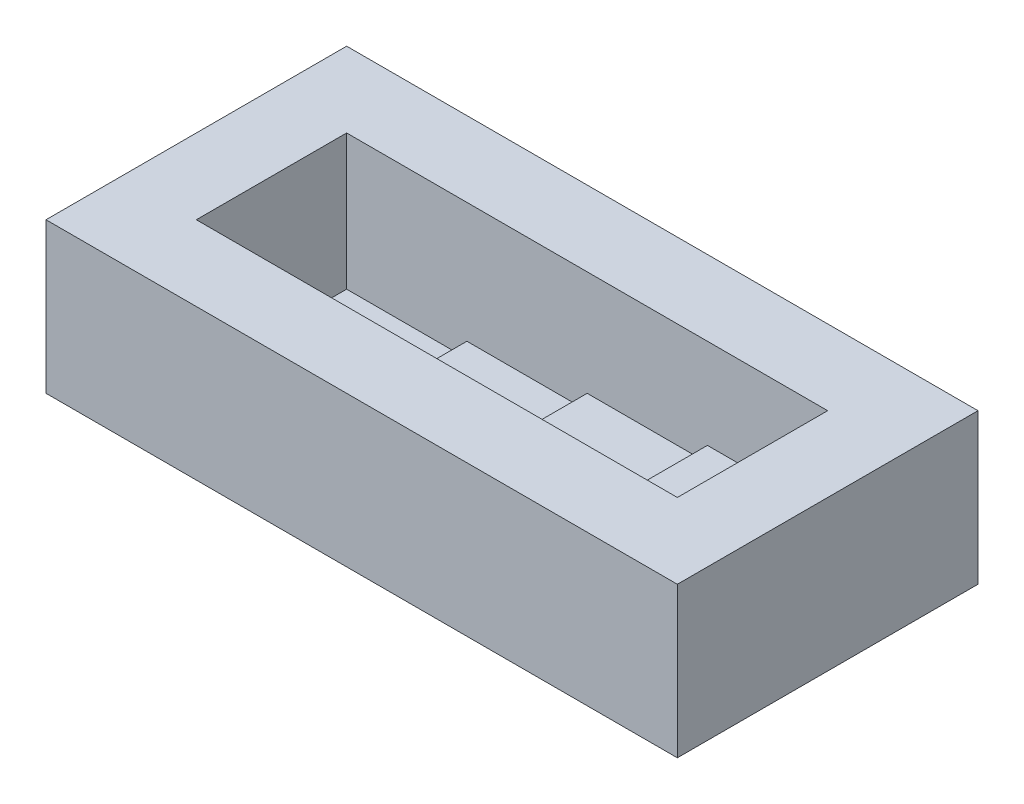
ISO-10303-21;
HEADER;
FILE_DESCRIPTION(('STEP AP214'),'2;1');
FILE_NAME('part.step','',(''),(''),'','','');
FILE_SCHEMA(('AUTOMOTIVE_DESIGN { 1 0 10303 214 1 1 1 1 }'));
ENDSEC;
DATA;
#1=APPLICATION_CONTEXT('core data for automotive mechanical design processes');
#2=APPLICATION_PROTOCOL_DEFINITION('international standard','automotive_design',2000,#1);
#3=PRODUCT_CONTEXT('',#1,'mechanical');
#4=PRODUCT('Part','Part','',(#3));
#5=PRODUCT_RELATED_PRODUCT_CATEGORY('part','',(#4));
#6=PRODUCT_DEFINITION_FORMATION('','',#4);
#7=PRODUCT_DEFINITION_CONTEXT('part definition',#1,'design');
#8=PRODUCT_DEFINITION('design','',#6,#7);
#9=PRODUCT_DEFINITION_SHAPE('','',#8);
#10=(LENGTH_UNIT() NAMED_UNIT(*) SI_UNIT(.MILLI.,.METRE.));
#11=(NAMED_UNIT(*) PLANE_ANGLE_UNIT() SI_UNIT($,.RADIAN.));
#12=(NAMED_UNIT(*) SI_UNIT($,.STERADIAN.) SOLID_ANGLE_UNIT());
#13=UNCERTAINTY_MEASURE_WITH_UNIT(LENGTH_MEASURE(1.E-05),#10,'distance_accuracy_value','');
#14=(GEOMETRIC_REPRESENTATION_CONTEXT(3) GLOBAL_UNCERTAINTY_ASSIGNED_CONTEXT((#13)) GLOBAL_UNIT_ASSIGNED_CONTEXT((#10,
#11,#12)) REPRESENTATION_CONTEXT('',''));
#15=CARTESIAN_POINT('',(0.,0.,0.));
#16=DIRECTION('',(0.,0.,1.));
#17=DIRECTION('',(1.,0.,0.));
#18=AXIS2_PLACEMENT_3D('',#15,#16,#17);
#19=CARTESIAN_POINT('',(20.,0.,10.));
#20=DIRECTION('',(0.,1.,0.));
#21=DIRECTION('',(-1.,0.,0.));
#22=AXIS2_PLACEMENT_3D('',#19,#20,#21);
#23=PLANE('',#22);
#24=DIRECTION('',(0.,0.,-1.));
#25=VECTOR('',#24,1.);
#26=CARTESIAN_POINT('',(-5.,0.,0.));
#27=LINE('',#26,#25);
#28=CARTESIAN_POINT('',(-5.,0.,15.));
#29=VERTEX_POINT('',#28);
#30=CARTESIAN_POINT('',(-5.,0.,-5.));
#31=VERTEX_POINT('',#30);
#32=EDGE_CURVE('E132',#29,#31,#27,.T.);
#33=ORIENTED_EDGE('',*,*,#32,.T.);
#34=DIRECTION('',(-1.,0.,0.));
#35=VECTOR('',#34,1.);
#36=CARTESIAN_POINT('',(-5.,0.,-5.));
#37=LINE('',#36,#35);
#38=CARTESIAN_POINT('',(37.,0.,-5.));
#39=VERTEX_POINT('',#38);
#40=EDGE_CURVE('E180',#39,#31,#37,.T.);
#41=ORIENTED_EDGE('',*,*,#40,.F.);
#42=DIRECTION('',(0.,0.,-1.));
#43=VECTOR('',#42,1.);
#44=CARTESIAN_POINT('',(37.,0.,10.));
#45=LINE('',#44,#43);
#46=CARTESIAN_POINT('',(37.,0.,15.));
#47=VERTEX_POINT('',#46);
#48=EDGE_CURVE('E147',#47,#39,#45,.T.);
#49=ORIENTED_EDGE('',*,*,#48,.F.);
#50=DIRECTION('',(1.,0.,0.));
#51=VECTOR('',#50,1.);
#52=CARTESIAN_POINT('',(-5.,0.,15.));
#53=LINE('',#52,#51);
#54=EDGE_CURVE('E145',#29,#47,#53,.T.);
#55=ORIENTED_EDGE('',*,*,#54,.F.);
#56=EDGE_LOOP('',(#33,#41,#49,#55));
#57=FACE_BOUND('',#56,.T.);
#58=ADVANCED_FACE('F36',(#57),#23,.F.);
#59=CARTESIAN_POINT('',(24.,4.,10.));
#60=DIRECTION('',(0.,-1.,0.));
#61=DIRECTION('',(0.,0.,-1.));
#62=AXIS2_PLACEMENT_3D('',#59,#60,#61);
#63=PLANE('',#62);
#64=DIRECTION('',(-1.,0.,0.));
#65=VECTOR('',#64,1.);
#66=CARTESIAN_POINT('',(24.,4.,0.));
#67=LINE('',#66,#65);
#68=CARTESIAN_POINT('',(32.,4.,0.));
#69=VERTEX_POINT('',#68);
#70=CARTESIAN_POINT('',(24.,4.,0.));
#71=VERTEX_POINT('',#70);
#72=EDGE_CURVE('E141',#69,#71,#67,.T.);
#73=ORIENTED_EDGE('',*,*,#72,.T.);
#74=DIRECTION('',(0.,0.,-1.));
#75=VECTOR('',#74,1.);
#76=CARTESIAN_POINT('',(24.,4.,10.));
#77=LINE('',#76,#75);
#78=CARTESIAN_POINT('',(24.,4.,10.));
#79=VERTEX_POINT('',#78);
#80=EDGE_CURVE('E44',#79,#71,#77,.T.);
#81=ORIENTED_EDGE('',*,*,#80,.F.);
#82=DIRECTION('',(-1.,0.,0.));
#83=VECTOR('',#82,1.);
#84=CARTESIAN_POINT('',(24.,4.,10.));
#85=LINE('',#84,#83);
#86=CARTESIAN_POINT('',(32.,4.,10.));
#87=VERTEX_POINT('',#86);
#88=EDGE_CURVE('E193',#87,#79,#85,.T.);
#89=ORIENTED_EDGE('',*,*,#88,.F.);
#90=DIRECTION('',(0.,0.,-1.));
#91=VECTOR('',#90,1.);
#92=CARTESIAN_POINT('',(32.,4.,10.));
#93=LINE('',#92,#91);
#94=EDGE_CURVE('E11',#87,#69,#93,.T.);
#95=ORIENTED_EDGE('',*,*,#94,.T.);
#96=EDGE_LOOP('',(#73,#81,#89,#95));
#97=FACE_BOUND('',#96,.T.);
#98=ADVANCED_FACE('F255',(#97),#63,.F.);
#99=CARTESIAN_POINT('',(24.,3.,10.));
#100=DIRECTION('',(1.,0.,0.));
#101=DIRECTION('',(0.,0.,-1.));
#102=AXIS2_PLACEMENT_3D('',#99,#100,#101);
#103=PLANE('',#102);
#104=DIRECTION('',(0.,-1.,0.));
#105=VECTOR('',#104,1.);
#106=CARTESIAN_POINT('',(24.,3.,0.));
#107=LINE('',#106,#105);
#108=CARTESIAN_POINT('',(24.,3.,0.));
#109=VERTEX_POINT('',#108);
#110=EDGE_CURVE('E217',#71,#109,#107,.T.);
#111=ORIENTED_EDGE('',*,*,#110,.T.);
#112=DIRECTION('',(0.,0.,-1.));
#113=VECTOR('',#112,1.);
#114=CARTESIAN_POINT('',(24.,3.,10.));
#115=LINE('',#114,#113);
#116=CARTESIAN_POINT('',(24.,3.,10.));
#117=VERTEX_POINT('',#116);
#118=EDGE_CURVE('E246',#117,#109,#115,.T.);
#119=ORIENTED_EDGE('',*,*,#118,.F.);
#120=DIRECTION('',(0.,-1.,0.));
#121=VECTOR('',#120,1.);
#122=CARTESIAN_POINT('',(24.,3.,10.));
#123=LINE('',#122,#121);
#124=EDGE_CURVE('E196',#79,#117,#123,.T.);
#125=ORIENTED_EDGE('',*,*,#124,.F.);
#126=ORIENTED_EDGE('',*,*,#80,.T.);
#127=EDGE_LOOP('',(#111,#119,#125,#126));
#128=FACE_BOUND('',#127,.T.);
#129=ADVANCED_FACE('F251',(#128),#103,.F.);
#130=CARTESIAN_POINT('',(16.,3.,10.));
#131=DIRECTION('',(0.,-1.,0.));
#132=DIRECTION('',(0.,0.,-1.));
#133=AXIS2_PLACEMENT_3D('',#130,#131,#132);
#134=PLANE('',#133);
#135=DIRECTION('',(-1.,0.,0.));
#136=VECTOR('',#135,1.);
#137=CARTESIAN_POINT('',(16.,3.,0.));
#138=LINE('',#137,#136);
#139=CARTESIAN_POINT('',(16.,3.,0.));
#140=VERTEX_POINT('',#139);
#141=EDGE_CURVE('E220',#109,#140,#138,.T.);
#142=ORIENTED_EDGE('',*,*,#141,.T.);
#143=DIRECTION('',(0.,0.,-1.));
#144=VECTOR('',#143,1.);
#145=CARTESIAN_POINT('',(16.,3.,10.));
#146=LINE('',#145,#144);
#147=CARTESIAN_POINT('',(16.,3.,10.));
#148=VERTEX_POINT('',#147);
#149=EDGE_CURVE('E243',#148,#140,#146,.T.);
#150=ORIENTED_EDGE('',*,*,#149,.F.);
#151=DIRECTION('',(-1.,0.,0.));
#152=VECTOR('',#151,1.);
#153=CARTESIAN_POINT('',(16.,3.,10.));
#154=LINE('',#153,#152);
#155=EDGE_CURVE('E200',#117,#148,#154,.T.);
#156=ORIENTED_EDGE('',*,*,#155,.F.);
#157=ORIENTED_EDGE('',*,*,#118,.T.);
#158=EDGE_LOOP('',(#142,#150,#156,#157));
#159=FACE_BOUND('',#158,.T.);
#160=ADVANCED_FACE('F261',(#159),#134,.F.);
#161=CARTESIAN_POINT('',(16.,2.,10.));
#162=DIRECTION('',(1.,0.,0.));
#163=DIRECTION('',(0.,0.,-1.));
#164=AXIS2_PLACEMENT_3D('',#161,#162,#163);
#165=PLANE('',#164);
#166=DIRECTION('',(0.,-1.,0.));
#167=VECTOR('',#166,1.);
#168=CARTESIAN_POINT('',(16.,2.,0.));
#169=LINE('',#168,#167);
#170=CARTESIAN_POINT('',(16.,2.,0.));
#171=VERTEX_POINT('',#170);
#172=EDGE_CURVE('E223',#140,#171,#169,.T.);
#173=ORIENTED_EDGE('',*,*,#172,.T.);
#174=DIRECTION('',(0.,0.,-1.));
#175=VECTOR('',#174,1.);
#176=CARTESIAN_POINT('',(16.,2.,10.));
#177=LINE('',#176,#175);
#178=CARTESIAN_POINT('',(16.,2.,10.));
#179=VERTEX_POINT('',#178);
#180=EDGE_CURVE('E240',#179,#171,#177,.T.);
#181=ORIENTED_EDGE('',*,*,#180,.F.);
#182=DIRECTION('',(0.,-1.,0.));
#183=VECTOR('',#182,1.);
#184=CARTESIAN_POINT('',(16.,2.,10.));
#185=LINE('',#184,#183);
#186=EDGE_CURVE('E203',#148,#179,#185,.T.);
#187=ORIENTED_EDGE('',*,*,#186,.F.);
#188=ORIENTED_EDGE('',*,*,#149,.T.);
#189=EDGE_LOOP('',(#173,#181,#187,#188));
#190=FACE_BOUND('',#189,.T.);
#191=ADVANCED_FACE('F265',(#190),#165,.F.);
#192=CARTESIAN_POINT('',(8.,2.,10.));
#193=DIRECTION('',(0.,-1.,0.));
#194=DIRECTION('',(0.,0.,-1.));
#195=AXIS2_PLACEMENT_3D('',#192,#193,#194);
#196=PLANE('',#195);
#197=DIRECTION('',(-1.,0.,0.));
#198=VECTOR('',#197,1.);
#199=CARTESIAN_POINT('',(8.,2.,0.));
#200=LINE('',#199,#198);
#201=CARTESIAN_POINT('',(8.,2.,0.));
#202=VERTEX_POINT('',#201);
#203=EDGE_CURVE('E226',#171,#202,#200,.T.);
#204=ORIENTED_EDGE('',*,*,#203,.T.);
#205=DIRECTION('',(0.,0.,-1.));
#206=VECTOR('',#205,1.);
#207=CARTESIAN_POINT('',(8.,2.,10.));
#208=LINE('',#207,#206);
#209=CARTESIAN_POINT('',(8.,2.,10.));
#210=VERTEX_POINT('',#209);
#211=EDGE_CURVE('E237',#210,#202,#208,.T.);
#212=ORIENTED_EDGE('',*,*,#211,.F.);
#213=DIRECTION('',(-1.,0.,0.));
#214=VECTOR('',#213,1.);
#215=CARTESIAN_POINT('',(8.,2.,10.));
#216=LINE('',#215,#214);
#217=EDGE_CURVE('E206',#179,#210,#216,.T.);
#218=ORIENTED_EDGE('',*,*,#217,.F.);
#219=ORIENTED_EDGE('',*,*,#180,.T.);
#220=EDGE_LOOP('',(#204,#212,#218,#219));
#221=FACE_BOUND('',#220,.T.);
#222=ADVANCED_FACE('F286',(#221),#196,.F.);
#223=CARTESIAN_POINT('',(8.,1.,10.));
#224=DIRECTION('',(1.,0.,0.));
#225=DIRECTION('',(0.,0.,-1.));
#226=AXIS2_PLACEMENT_3D('',#223,#224,#225);
#227=PLANE('',#226);
#228=DIRECTION('',(0.,-1.,0.));
#229=VECTOR('',#228,1.);
#230=CARTESIAN_POINT('',(8.,1.,0.));
#231=LINE('',#230,#229);
#232=CARTESIAN_POINT('',(8.,1.,0.));
#233=VERTEX_POINT('',#232);
#234=EDGE_CURVE('E229',#202,#233,#231,.T.);
#235=ORIENTED_EDGE('',*,*,#234,.T.);
#236=DIRECTION('',(0.,0.,-1.));
#237=VECTOR('',#236,1.);
#238=CARTESIAN_POINT('',(8.,1.,10.));
#239=LINE('',#238,#237);
#240=CARTESIAN_POINT('',(8.,1.,10.));
#241=VERTEX_POINT('',#240);
#242=EDGE_CURVE('E234',#241,#233,#239,.T.);
#243=ORIENTED_EDGE('',*,*,#242,.F.);
#244=DIRECTION('',(0.,-1.,0.));
#245=VECTOR('',#244,1.);
#246=CARTESIAN_POINT('',(8.,1.,10.));
#247=LINE('',#246,#245);
#248=EDGE_CURVE('E209',#210,#241,#247,.T.);
#249=ORIENTED_EDGE('',*,*,#248,.F.);
#250=ORIENTED_EDGE('',*,*,#211,.T.);
#251=EDGE_LOOP('',(#235,#243,#249,#250));
#252=FACE_BOUND('',#251,.T.);
#253=ADVANCED_FACE('F284',(#252),#227,.F.);
#254=CARTESIAN_POINT('',(0.,1.,10.));
#255=DIRECTION('',(0.,-1.,0.));
#256=DIRECTION('',(0.,0.,-1.));
#257=AXIS2_PLACEMENT_3D('',#254,#255,#256);
#258=PLANE('',#257);
#259=DIRECTION('',(-1.,0.,0.));
#260=VECTOR('',#259,1.);
#261=CARTESIAN_POINT('',(0.,1.,0.));
#262=LINE('',#261,#260);
#263=CARTESIAN_POINT('',(0.,1.,0.));
#264=VERTEX_POINT('',#263);
#265=EDGE_CURVE('E197',#233,#264,#262,.T.);
#266=ORIENTED_EDGE('',*,*,#265,.T.);
#267=DIRECTION('',(0.,0.,-1.));
#268=VECTOR('',#267,1.);
#269=CARTESIAN_POINT('',(0.,1.,10.));
#270=LINE('',#269,#268);
#271=CARTESIAN_POINT('',(0.,1.,10.));
#272=VERTEX_POINT('',#271);
#273=EDGE_CURVE('E51',#272,#264,#270,.T.);
#274=ORIENTED_EDGE('',*,*,#273,.F.);
#275=DIRECTION('',(-1.,0.,0.));
#276=VECTOR('',#275,1.);
#277=CARTESIAN_POINT('',(0.,1.,10.));
#278=LINE('',#277,#276);
#279=EDGE_CURVE('E212',#241,#272,#278,.T.);
#280=ORIENTED_EDGE('',*,*,#279,.F.);
#281=ORIENTED_EDGE('',*,*,#242,.T.);
#282=EDGE_LOOP('',(#266,#274,#280,#281));
#283=FACE_BOUND('',#282,.T.);
#284=ADVANCED_FACE('F282',(#283),#258,.F.);
#285=CARTESIAN_POINT('',(-5.,10.,0.));
#286=DIRECTION('',(0.,1.,0.));
#287=DIRECTION('',(0.,0.,1.));
#288=AXIS2_PLACEMENT_3D('',#285,#286,#287);
#289=PLANE('',#288);
#290=DIRECTION('',(-1.,0.,0.));
#291=VECTOR('',#290,1.);
#292=CARTESIAN_POINT('',(-5.,10.,10.));
#293=LINE('',#292,#291);
#294=CARTESIAN_POINT('',(32.,10.,10.));
#295=VERTEX_POINT('',#294);
#296=CARTESIAN_POINT('',(0.,10.,10.));
#297=VERTEX_POINT('',#296);
#298=EDGE_CURVE('E157',#295,#297,#293,.T.);
#299=ORIENTED_EDGE('',*,*,#298,.T.);
#300=DIRECTION('',(0.,0.,1.));
#301=VECTOR('',#300,1.);
#302=CARTESIAN_POINT('',(0.,10.,0.));
#303=LINE('',#302,#301);
#304=CARTESIAN_POINT('',(0.,10.,0.));
#305=VERTEX_POINT('',#304);
#306=EDGE_CURVE('E190',#305,#297,#303,.T.);
#307=ORIENTED_EDGE('',*,*,#306,.F.);
#308=DIRECTION('',(1.,0.,0.));
#309=VECTOR('',#308,1.);
#310=CARTESIAN_POINT('',(-5.,10.,0.));
#311=LINE('',#310,#309);
#312=CARTESIAN_POINT('',(32.,10.,0.));
#313=VERTEX_POINT('',#312);
#314=EDGE_CURVE('E172',#305,#313,#311,.T.);
#315=ORIENTED_EDGE('',*,*,#314,.T.);
#316=DIRECTION('',(0.,0.,1.));
#317=VECTOR('',#316,1.);
#318=CARTESIAN_POINT('',(32.,10.,10.));
#319=LINE('',#318,#317);
#320=EDGE_CURVE('E167',#313,#295,#319,.T.);
#321=ORIENTED_EDGE('',*,*,#320,.T.);
#322=EDGE_LOOP('',(#299,#307,#315,#321));
#323=FACE_BOUND('',#322,.T.);
#324=DIRECTION('',(0.,0.,1.));
#325=VECTOR('',#324,1.);
#326=CARTESIAN_POINT('',(-5.,10.,0.));
#327=LINE('',#326,#325);
#328=CARTESIAN_POINT('',(-5.,10.,-5.));
#329=VERTEX_POINT('',#328);
#330=CARTESIAN_POINT('',(-5.,10.,15.));
#331=VERTEX_POINT('',#330);
#332=EDGE_CURVE('E142',#329,#331,#327,.T.);
#333=ORIENTED_EDGE('',*,*,#332,.T.);
#334=DIRECTION('',(-1.,0.,0.));
#335=VECTOR('',#334,1.);
#336=CARTESIAN_POINT('',(-5.,10.,15.));
#337=LINE('',#336,#335);
#338=CARTESIAN_POINT('',(37.,10.,15.));
#339=VERTEX_POINT('',#338);
#340=EDGE_CURVE('E156',#339,#331,#337,.T.);
#341=ORIENTED_EDGE('',*,*,#340,.F.);
#342=DIRECTION('',(0.,0.,1.));
#343=VECTOR('',#342,1.);
#344=CARTESIAN_POINT('',(37.,10.,10.));
#345=LINE('',#344,#343);
#346=CARTESIAN_POINT('',(37.,10.,-5.));
#347=VERTEX_POINT('',#346);
#348=EDGE_CURVE('E170',#347,#339,#345,.T.);
#349=ORIENTED_EDGE('',*,*,#348,.F.);
#350=DIRECTION('',(1.,0.,0.));
#351=VECTOR('',#350,1.);
#352=CARTESIAN_POINT('',(-5.,10.,-5.));
#353=LINE('',#352,#351);
#354=EDGE_CURVE('E177',#329,#347,#353,.T.);
#355=ORIENTED_EDGE('',*,*,#354,.F.);
#356=EDGE_LOOP('',(#333,#341,#349,#355));
#357=FACE_BOUND('',#356,.T.);
#358=ADVANCED_FACE('F276',(#323,#357),#289,.T.);
#359=CARTESIAN_POINT('',(-5.,0.,0.));
#360=DIRECTION('',(1.,0.,0.));
#361=DIRECTION('',(0.,0.,-1.));
#362=AXIS2_PLACEMENT_3D('',#359,#360,#361);
#363=PLANE('',#362);
#364=ORIENTED_EDGE('',*,*,#332,.F.);
#365=DIRECTION('',(0.,1.,0.));
#366=VECTOR('',#365,1.);
#367=CARTESIAN_POINT('',(-5.,10.,-5.));
#368=LINE('',#367,#366);
#369=EDGE_CURVE('E138',#31,#329,#368,.T.);
#370=ORIENTED_EDGE('',*,*,#369,.F.);
#371=ORIENTED_EDGE('',*,*,#32,.F.);
#372=DIRECTION('',(0.,-1.,0.));
#373=VECTOR('',#372,1.);
#374=CARTESIAN_POINT('',(-5.,0.,15.));
#375=LINE('',#374,#373);
#376=EDGE_CURVE('E136',#331,#29,#375,.T.);
#377=ORIENTED_EDGE('',*,*,#376,.F.);
#378=EDGE_LOOP('',(#364,#370,#371,#377));
#379=FACE_BOUND('',#378,.T.);
#380=ADVANCED_FACE('F134',(#379),#363,.F.);
#381=CARTESIAN_POINT('',(0.,0.,0.));
#382=DIRECTION('',(1.,0.,0.));
#383=DIRECTION('',(0.,0.,-1.));
#384=AXIS2_PLACEMENT_3D('',#381,#382,#383);
#385=PLANE('',#384);
#386=DIRECTION('',(0.,-1.,0.));
#387=VECTOR('',#386,1.);
#388=CARTESIAN_POINT('',(0.,0.,10.));
#389=LINE('',#388,#387);
#390=EDGE_CURVE('E186',#297,#272,#389,.T.);
#391=ORIENTED_EDGE('',*,*,#390,.T.);
#392=ORIENTED_EDGE('',*,*,#273,.T.);
#393=DIRECTION('',(0.,1.,0.));
#394=VECTOR('',#393,1.);
#395=CARTESIAN_POINT('',(0.,0.,0.));
#396=LINE('',#395,#394);
#397=EDGE_CURVE('E182',#264,#305,#396,.T.);
#398=ORIENTED_EDGE('',*,*,#397,.T.);
#399=ORIENTED_EDGE('',*,*,#306,.T.);
#400=EDGE_LOOP('',(#391,#392,#398,#399));
#401=FACE_BOUND('',#400,.T.);
#402=ADVANCED_FACE('F279',(#401),#385,.T.);
#403=CARTESIAN_POINT('',(0.,0.,0.));
#404=DIRECTION('',(0.,0.,1.));
#405=DIRECTION('',(1.,0.,0.));
#406=AXIS2_PLACEMENT_3D('',#403,#404,#405);
#407=PLANE('',#406);
#408=ORIENTED_EDGE('',*,*,#397,.F.);
#409=ORIENTED_EDGE('',*,*,#265,.F.);
#410=ORIENTED_EDGE('',*,*,#234,.F.);
#411=ORIENTED_EDGE('',*,*,#203,.F.);
#412=ORIENTED_EDGE('',*,*,#172,.F.);
#413=ORIENTED_EDGE('',*,*,#141,.F.);
#414=ORIENTED_EDGE('',*,*,#110,.F.);
#415=ORIENTED_EDGE('',*,*,#72,.F.);
#416=DIRECTION('',(0.,-1.,0.));
#417=VECTOR('',#416,1.);
#418=CARTESIAN_POINT('',(32.,10.,0.));
#419=LINE('',#418,#417);
#420=EDGE_CURVE('E178',#313,#69,#419,.T.);
#421=ORIENTED_EDGE('',*,*,#420,.F.);
#422=ORIENTED_EDGE('',*,*,#314,.F.);
#423=EDGE_LOOP('',(#408,#409,#410,#411,#412,#413,#414,#415,#421,#422));
#424=FACE_BOUND('',#423,.T.);
#425=ADVANCED_FACE('F259',(#424),#407,.T.);
#426=CARTESIAN_POINT('',(0.,0.,-5.));
#427=DIRECTION('',(0.,0.,1.));
#428=DIRECTION('',(1.,0.,0.));
#429=AXIS2_PLACEMENT_3D('',#426,#427,#428);
#430=PLANE('',#429);
#431=ORIENTED_EDGE('',*,*,#369,.T.);
#432=ORIENTED_EDGE('',*,*,#354,.T.);
#433=DIRECTION('',(0.,1.,0.));
#434=VECTOR('',#433,1.);
#435=CARTESIAN_POINT('',(37.,0.,-5.));
#436=LINE('',#435,#434);
#437=EDGE_CURVE('E166',#39,#347,#436,.T.);
#438=ORIENTED_EDGE('',*,*,#437,.F.);
#439=ORIENTED_EDGE('',*,*,#40,.T.);
#440=EDGE_LOOP('',(#431,#432,#438,#439));
#441=FACE_BOUND('',#440,.T.);
#442=ADVANCED_FACE('F372',(#441),#430,.F.);
#443=CARTESIAN_POINT('',(37.,0.,0.));
#444=DIRECTION('',(-1.,0.,0.));
#445=DIRECTION('',(0.,0.,1.));
#446=AXIS2_PLACEMENT_3D('',#443,#444,#445);
#447=PLANE('',#446);
#448=ORIENTED_EDGE('',*,*,#348,.T.);
#449=DIRECTION('',(0.,1.,0.));
#450=VECTOR('',#449,1.);
#451=CARTESIAN_POINT('',(37.,0.,15.));
#452=LINE('',#451,#450);
#453=EDGE_CURVE('E151',#47,#339,#452,.T.);
#454=ORIENTED_EDGE('',*,*,#453,.F.);
#455=ORIENTED_EDGE('',*,*,#48,.T.);
#456=ORIENTED_EDGE('',*,*,#437,.T.);
#457=EDGE_LOOP('',(#448,#454,#455,#456));
#458=FACE_BOUND('',#457,.T.);
#459=ADVANCED_FACE('F368',(#458),#447,.F.);
#460=CARTESIAN_POINT('',(32.,0.,0.));
#461=DIRECTION('',(-1.,0.,0.));
#462=DIRECTION('',(0.,0.,1.));
#463=AXIS2_PLACEMENT_3D('',#460,#461,#462);
#464=PLANE('',#463);
#465=ORIENTED_EDGE('',*,*,#320,.F.);
#466=ORIENTED_EDGE('',*,*,#420,.T.);
#467=ORIENTED_EDGE('',*,*,#94,.F.);
#468=DIRECTION('',(0.,-1.,0.));
#469=VECTOR('',#468,1.);
#470=CARTESIAN_POINT('',(32.,0.,10.));
#471=LINE('',#470,#469);
#472=EDGE_CURVE('E163',#295,#87,#471,.T.);
#473=ORIENTED_EDGE('',*,*,#472,.F.);
#474=EDGE_LOOP('',(#465,#466,#467,#473));
#475=FACE_BOUND('',#474,.T.);
#476=ADVANCED_FACE('F273',(#475),#464,.T.);
#477=CARTESIAN_POINT('',(0.,0.,10.));
#478=DIRECTION('',(0.,0.,-1.));
#479=DIRECTION('',(-1.,0.,0.));
#480=AXIS2_PLACEMENT_3D('',#477,#478,#479);
#481=PLANE('',#480);
#482=ORIENTED_EDGE('',*,*,#390,.F.);
#483=ORIENTED_EDGE('',*,*,#298,.F.);
#484=ORIENTED_EDGE('',*,*,#472,.T.);
#485=ORIENTED_EDGE('',*,*,#88,.T.);
#486=ORIENTED_EDGE('',*,*,#124,.T.);
#487=ORIENTED_EDGE('',*,*,#155,.T.);
#488=ORIENTED_EDGE('',*,*,#186,.T.);
#489=ORIENTED_EDGE('',*,*,#217,.T.);
#490=ORIENTED_EDGE('',*,*,#248,.T.);
#491=ORIENTED_EDGE('',*,*,#279,.T.);
#492=EDGE_LOOP('',(#482,#483,#484,#485,#486,#487,#488,#489,#490,#491));
#493=FACE_BOUND('',#492,.T.);
#494=ADVANCED_FACE('F269',(#493),#481,.T.);
#495=CARTESIAN_POINT('',(0.,0.,15.));
#496=DIRECTION('',(0.,0.,-1.));
#497=DIRECTION('',(-1.,0.,0.));
#498=AXIS2_PLACEMENT_3D('',#495,#496,#497);
#499=PLANE('',#498);
#500=ORIENTED_EDGE('',*,*,#376,.T.);
#501=ORIENTED_EDGE('',*,*,#54,.T.);
#502=ORIENTED_EDGE('',*,*,#453,.T.);
#503=ORIENTED_EDGE('',*,*,#340,.T.);
#504=EDGE_LOOP('',(#500,#501,#502,#503));
#505=FACE_BOUND('',#504,.T.);
#506=ADVANCED_FACE('F154',(#505),#499,.F.);
#507=CLOSED_SHELL('',(#58,#98,#129,#160,#191,#222,#253,#284,#358,#380,#402,#425,#442,#459,#476,
#494,#506));
#508=MANIFOLD_SOLID_BREP('B2',#507);
#509=ADVANCED_BREP_SHAPE_REPRESENTATION('',(#18,#508),#14);
#510=SHAPE_DEFINITION_REPRESENTATION(#9,#509);
ENDSEC;
END-ISO-10303-21;
